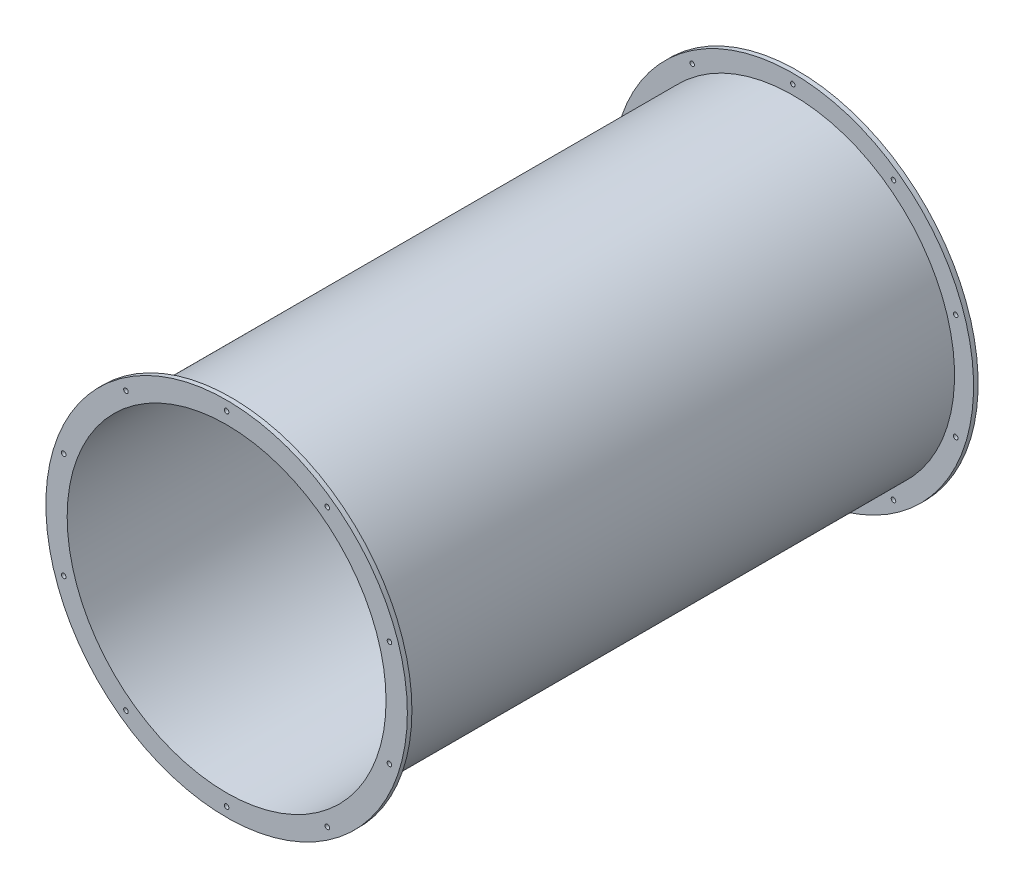
ISO-10303-21;
HEADER;
FILE_DESCRIPTION(('STEP AP214'),'2;1');
FILE_NAME('part.step','',(''),(''),'','','');
FILE_SCHEMA(('AUTOMOTIVE_DESIGN { 1 0 10303 214 1 1 1 1 }'));
ENDSEC;
DATA;
#1=APPLICATION_CONTEXT('core data for automotive mechanical design processes');
#2=APPLICATION_PROTOCOL_DEFINITION('international standard','automotive_design',2000,#1);
#3=PRODUCT_CONTEXT('',#1,'mechanical');
#4=PRODUCT('Part','Part','',(#3));
#5=PRODUCT_RELATED_PRODUCT_CATEGORY('part','',(#4));
#6=PRODUCT_DEFINITION_FORMATION('','',#4);
#7=PRODUCT_DEFINITION_CONTEXT('part definition',#1,'design');
#8=PRODUCT_DEFINITION('design','',#6,#7);
#9=PRODUCT_DEFINITION_SHAPE('','',#8);
#10=(LENGTH_UNIT() NAMED_UNIT(*) SI_UNIT(.MILLI.,.METRE.));
#11=(NAMED_UNIT(*) PLANE_ANGLE_UNIT() SI_UNIT($,.RADIAN.));
#12=(NAMED_UNIT(*) SI_UNIT($,.STERADIAN.) SOLID_ANGLE_UNIT());
#13=UNCERTAINTY_MEASURE_WITH_UNIT(LENGTH_MEASURE(1.E-05),#10,'distance_accuracy_value','');
#14=(GEOMETRIC_REPRESENTATION_CONTEXT(3) GLOBAL_UNCERTAINTY_ASSIGNED_CONTEXT((#13)) GLOBAL_UNIT_ASSIGNED_CONTEXT((#10,
#11,#12)) REPRESENTATION_CONTEXT('',''));
#15=CARTESIAN_POINT('',(0.,0.,0.));
#16=DIRECTION('',(0.,0.,1.));
#17=DIRECTION('',(1.,0.,0.));
#18=AXIS2_PLACEMENT_3D('',#15,#16,#17);
#19=CARTESIAN_POINT('',(0.,0.,1500.));
#20=DIRECTION('',(0.,0.,-1.));
#21=DIRECTION('',(-1.,0.,0.));
#22=AXIS2_PLACEMENT_3D('',#19,#20,#21);
#23=CYLINDRICAL_SURFACE('',#22,425.);
#24=CARTESIAN_POINT('',(0.,0.,1488.));
#25=DIRECTION('',(0.,0.,1.));
#26=DIRECTION('',(1.,0.,0.));
#27=AXIS2_PLACEMENT_3D('',#24,#25,#26);
#28=CIRCLE('',#27,425.);
#29=CARTESIAN_POINT('',(425.,0.,1488.));
#30=VERTEX_POINT('',#29);
#31=EDGE_CURVE('E39',#30,#30,#28,.T.);
#32=ORIENTED_EDGE('',*,*,#31,.F.);
#33=EDGE_LOOP('',(#32));
#34=FACE_BOUND('',#33,.T.);
#35=CARTESIAN_POINT('',(0.,0.,12.));
#36=DIRECTION('',(0.,0.,-1.));
#37=DIRECTION('',(-1.,0.,0.));
#38=AXIS2_PLACEMENT_3D('',#35,#36,#37);
#39=CIRCLE('',#38,425.);
#40=CARTESIAN_POINT('',(-425.,0.,12.));
#41=VERTEX_POINT('',#40);
#42=EDGE_CURVE('E10',#41,#41,#39,.T.);
#43=ORIENTED_EDGE('',*,*,#42,.F.);
#44=EDGE_LOOP('',(#43));
#45=FACE_BOUND('',#44,.T.);
#46=ADVANCED_FACE('F32',(#34,#45),#23,.T.);
#47=CARTESIAN_POINT('',(0.,0.,1500.));
#48=DIRECTION('',(0.,0.,1.));
#49=DIRECTION('',(1.,0.,0.));
#50=AXIS2_PLACEMENT_3D('',#47,#48,#49);
#51=PLANE('',#50);
#52=CARTESIAN_POINT('',(0.,450.,1500.));
#53=DIRECTION('',(0.,0.,1.));
#54=DIRECTION('',(1.,0.,0.));
#55=AXIS2_PLACEMENT_3D('',#52,#53,#54);
#56=CIRCLE('',#55,6.00000000000001);
#57=CARTESIAN_POINT('',(6.00000000000001,450.,1500.));
#58=VERTEX_POINT('',#57);
#59=EDGE_CURVE('E256',#58,#58,#56,.T.);
#60=ORIENTED_EDGE('',*,*,#59,.F.);
#61=EDGE_LOOP('',(#60));
#62=FACE_BOUND('',#61,.T.);
#63=CARTESIAN_POINT('',(-264.503363531613,364.057647468727,1500.));
#64=DIRECTION('',(0.,0.,1.));
#65=DIRECTION('',(1.,0.,0.));
#66=AXIS2_PLACEMENT_3D('',#63,#64,#65);
#67=CIRCLE('',#66,5.99999999999999);
#68=CARTESIAN_POINT('',(-258.503363531613,364.057647468727,1500.));
#69=VERTEX_POINT('',#68);
#70=EDGE_CURVE('E264',#69,#69,#67,.T.);
#71=ORIENTED_EDGE('',*,*,#70,.F.);
#72=EDGE_LOOP('',(#71));
#73=FACE_BOUND('',#72,.T.);
#74=CARTESIAN_POINT('',(-427.975432332819,139.057647468727,1500.));
#75=DIRECTION('',(0.,0.,1.));
#76=DIRECTION('',(1.,0.,0.));
#77=AXIS2_PLACEMENT_3D('',#74,#75,#76);
#78=CIRCLE('',#77,5.99999999999999);
#79=CARTESIAN_POINT('',(-421.975432332819,139.057647468727,1500.));
#80=VERTEX_POINT('',#79);
#81=EDGE_CURVE('E305',#80,#80,#78,.T.);
#82=ORIENTED_EDGE('',*,*,#81,.F.);
#83=EDGE_LOOP('',(#82));
#84=FACE_BOUND('',#83,.T.);
#85=CARTESIAN_POINT('',(-427.975432332819,-139.057647468725,1500.));
#86=DIRECTION('',(0.,0.,1.));
#87=DIRECTION('',(1.,0.,0.));
#88=AXIS2_PLACEMENT_3D('',#85,#86,#87);
#89=CIRCLE('',#88,5.99999999999999);
#90=CARTESIAN_POINT('',(-421.975432332819,-139.057647468725,1500.));
#91=VERTEX_POINT('',#90);
#92=EDGE_CURVE('E299',#91,#91,#89,.T.);
#93=ORIENTED_EDGE('',*,*,#92,.F.);
#94=EDGE_LOOP('',(#93));
#95=FACE_BOUND('',#94,.T.);
#96=CARTESIAN_POINT('',(-264.503363531613,-364.057647468725,1500.));
#97=DIRECTION('',(0.,0.,1.));
#98=DIRECTION('',(1.,0.,0.));
#99=AXIS2_PLACEMENT_3D('',#96,#97,#98);
#100=CIRCLE('',#99,5.99999999999999);
#101=CARTESIAN_POINT('',(-258.503363531613,-364.057647468725,1500.));
#102=VERTEX_POINT('',#101);
#103=EDGE_CURVE('E293',#102,#102,#100,.T.);
#104=ORIENTED_EDGE('',*,*,#103,.F.);
#105=EDGE_LOOP('',(#104));
#106=FACE_BOUND('',#105,.T.);
#107=CARTESIAN_POINT('',(-2.5369087789741E-13,-449.999999999999,1500.));
#108=DIRECTION('',(0.,0.,1.));
#109=DIRECTION('',(1.,0.,0.));
#110=AXIS2_PLACEMENT_3D('',#107,#108,#109);
#111=CIRCLE('',#110,6.00000000000001);
#112=CARTESIAN_POINT('',(5.99999999999976,-449.999999999999,1500.));
#113=VERTEX_POINT('',#112);
#114=EDGE_CURVE('E287',#113,#113,#111,.T.);
#115=ORIENTED_EDGE('',*,*,#114,.F.);
#116=EDGE_LOOP('',(#115));
#117=FACE_BOUND('',#116,.T.);
#118=CARTESIAN_POINT('',(264.503363531612,-364.057647468725,1500.));
#119=DIRECTION('',(0.,0.,1.));
#120=DIRECTION('',(1.,0.,0.));
#121=AXIS2_PLACEMENT_3D('',#118,#119,#120);
#122=CIRCLE('',#121,5.99999999999999);
#123=CARTESIAN_POINT('',(270.503363531612,-364.057647468725,1500.));
#124=VERTEX_POINT('',#123);
#125=EDGE_CURVE('E281',#124,#124,#122,.T.);
#126=ORIENTED_EDGE('',*,*,#125,.F.);
#127=EDGE_LOOP('',(#126));
#128=FACE_BOUND('',#127,.T.);
#129=CARTESIAN_POINT('',(427.975432332818,-139.057647468726,1500.));
#130=DIRECTION('',(0.,0.,1.));
#131=DIRECTION('',(1.,0.,0.));
#132=AXIS2_PLACEMENT_3D('',#129,#130,#131);
#133=CIRCLE('',#132,5.99999999999999);
#134=CARTESIAN_POINT('',(433.975432332818,-139.057647468726,1500.));
#135=VERTEX_POINT('',#134);
#136=EDGE_CURVE('E275',#135,#135,#133,.T.);
#137=ORIENTED_EDGE('',*,*,#136,.F.);
#138=EDGE_LOOP('',(#137));
#139=FACE_BOUND('',#138,.T.);
#140=CARTESIAN_POINT('',(427.975432332818,139.057647468727,1500.));
#141=DIRECTION('',(0.,0.,1.));
#142=DIRECTION('',(1.,0.,0.));
#143=AXIS2_PLACEMENT_3D('',#140,#141,#142);
#144=CIRCLE('',#143,5.99999999999999);
#145=CARTESIAN_POINT('',(433.975432332819,139.057647468727,1500.));
#146=VERTEX_POINT('',#145);
#147=EDGE_CURVE('E269',#146,#146,#144,.T.);
#148=ORIENTED_EDGE('',*,*,#147,.F.);
#149=EDGE_LOOP('',(#148));
#150=FACE_BOUND('',#149,.T.);
#151=CARTESIAN_POINT('',(264.503363531612,364.057647468727,1500.));
#152=DIRECTION('',(0.,0.,1.));
#153=DIRECTION('',(1.,0.,0.));
#154=AXIS2_PLACEMENT_3D('',#151,#152,#153);
#155=CIRCLE('',#154,5.99999999999999);
#156=CARTESIAN_POINT('',(270.503363531612,364.057647468727,1500.));
#157=VERTEX_POINT('',#156);
#158=EDGE_CURVE('E257',#157,#157,#155,.T.);
#159=ORIENTED_EDGE('',*,*,#158,.F.);
#160=EDGE_LOOP('',(#159));
#161=FACE_BOUND('',#160,.T.);
#162=CARTESIAN_POINT('',(0.,0.,1500.));
#163=DIRECTION('',(0.,0.,1.));
#164=DIRECTION('',(1.,0.,0.));
#165=AXIS2_PLACEMENT_3D('',#162,#163,#164);
#166=CIRCLE('',#165,419.);
#167=CARTESIAN_POINT('',(419.,0.,1500.));
#168=VERTEX_POINT('',#167);
#169=EDGE_CURVE('E44',#168,#168,#166,.T.);
#170=ORIENTED_EDGE('',*,*,#169,.F.);
#171=EDGE_LOOP('',(#170));
#172=FACE_BOUND('',#171,.T.);
#173=CARTESIAN_POINT('',(0.,0.,1500.));
#174=DIRECTION('',(0.,0.,1.));
#175=DIRECTION('',(1.,0.,0.));
#176=AXIS2_PLACEMENT_3D('',#173,#174,#175);
#177=CIRCLE('',#176,475.);
#178=CARTESIAN_POINT('',(475.,0.,1500.));
#179=VERTEX_POINT('',#178);
#180=EDGE_CURVE('E101',#179,#179,#177,.T.);
#181=ORIENTED_EDGE('',*,*,#180,.T.);
#182=EDGE_LOOP('',(#181));
#183=FACE_BOUND('',#182,.T.);
#184=ADVANCED_FACE('F129',(#62,#73,#84,#95,#106,#117,#128,#139,#150,#161,#172,#183),#51,.T.);
#185=CARTESIAN_POINT('',(0.,0.,0.));
#186=DIRECTION('',(0.,0.,1.));
#187=DIRECTION('',(1.,0.,0.));
#188=AXIS2_PLACEMENT_3D('',#185,#186,#187);
#189=PLANE('',#188);
#190=CARTESIAN_POINT('',(0.,450.,0.));
#191=DIRECTION('',(0.,0.,1.));
#192=DIRECTION('',(1.,0.,0.));
#193=AXIS2_PLACEMENT_3D('',#190,#191,#192);
#194=CIRCLE('',#193,6.00000000000001);
#195=CARTESIAN_POINT('',(6.00000000000001,450.,0.));
#196=VERTEX_POINT('',#195);
#197=EDGE_CURVE('E52',#196,#196,#194,.T.);
#198=ORIENTED_EDGE('',*,*,#197,.T.);
#199=EDGE_LOOP('',(#198));
#200=FACE_BOUND('',#199,.T.);
#201=CARTESIAN_POINT('',(-264.503363531613,364.057647468727,0.));
#202=DIRECTION('',(0.,0.,1.));
#203=DIRECTION('',(1.,0.,0.));
#204=AXIS2_PLACEMENT_3D('',#201,#202,#203);
#205=CIRCLE('',#204,5.99999999999999);
#206=CARTESIAN_POINT('',(-258.503363531613,364.057647468727,0.));
#207=VERTEX_POINT('',#206);
#208=EDGE_CURVE('E308',#207,#207,#205,.T.);
#209=ORIENTED_EDGE('',*,*,#208,.T.);
#210=EDGE_LOOP('',(#209));
#211=FACE_BOUND('',#210,.T.);
#212=CARTESIAN_POINT('',(-427.975432332819,139.057647468727,0.));
#213=DIRECTION('',(0.,0.,1.));
#214=DIRECTION('',(1.,0.,0.));
#215=AXIS2_PLACEMENT_3D('',#212,#213,#214);
#216=CIRCLE('',#215,5.99999999999999);
#217=CARTESIAN_POINT('',(-421.975432332819,139.057647468727,0.));
#218=VERTEX_POINT('',#217);
#219=EDGE_CURVE('E302',#218,#218,#216,.T.);
#220=ORIENTED_EDGE('',*,*,#219,.T.);
#221=EDGE_LOOP('',(#220));
#222=FACE_BOUND('',#221,.T.);
#223=CARTESIAN_POINT('',(-427.975432332819,-139.057647468725,0.));
#224=DIRECTION('',(0.,0.,1.));
#225=DIRECTION('',(1.,0.,0.));
#226=AXIS2_PLACEMENT_3D('',#223,#224,#225);
#227=CIRCLE('',#226,5.99999999999999);
#228=CARTESIAN_POINT('',(-421.975432332819,-139.057647468725,0.));
#229=VERTEX_POINT('',#228);
#230=EDGE_CURVE('E296',#229,#229,#227,.T.);
#231=ORIENTED_EDGE('',*,*,#230,.T.);
#232=EDGE_LOOP('',(#231));
#233=FACE_BOUND('',#232,.T.);
#234=CARTESIAN_POINT('',(-264.503363531613,-364.057647468725,0.));
#235=DIRECTION('',(0.,0.,1.));
#236=DIRECTION('',(1.,0.,0.));
#237=AXIS2_PLACEMENT_3D('',#234,#235,#236);
#238=CIRCLE('',#237,5.99999999999999);
#239=CARTESIAN_POINT('',(-258.503363531613,-364.057647468725,0.));
#240=VERTEX_POINT('',#239);
#241=EDGE_CURVE('E290',#240,#240,#238,.T.);
#242=ORIENTED_EDGE('',*,*,#241,.T.);
#243=EDGE_LOOP('',(#242));
#244=FACE_BOUND('',#243,.T.);
#245=CARTESIAN_POINT('',(-2.5369087789741E-13,-449.999999999999,0.));
#246=DIRECTION('',(0.,0.,1.));
#247=DIRECTION('',(1.,0.,0.));
#248=AXIS2_PLACEMENT_3D('',#245,#246,#247);
#249=CIRCLE('',#248,6.00000000000001);
#250=CARTESIAN_POINT('',(5.99999999999976,-449.999999999999,0.));
#251=VERTEX_POINT('',#250);
#252=EDGE_CURVE('E284',#251,#251,#249,.T.);
#253=ORIENTED_EDGE('',*,*,#252,.T.);
#254=EDGE_LOOP('',(#253));
#255=FACE_BOUND('',#254,.T.);
#256=CARTESIAN_POINT('',(264.503363531612,-364.057647468725,0.));
#257=DIRECTION('',(0.,0.,1.));
#258=DIRECTION('',(1.,0.,0.));
#259=AXIS2_PLACEMENT_3D('',#256,#257,#258);
#260=CIRCLE('',#259,5.99999999999999);
#261=CARTESIAN_POINT('',(270.503363531612,-364.057647468725,0.));
#262=VERTEX_POINT('',#261);
#263=EDGE_CURVE('E278',#262,#262,#260,.T.);
#264=ORIENTED_EDGE('',*,*,#263,.T.);
#265=EDGE_LOOP('',(#264));
#266=FACE_BOUND('',#265,.T.);
#267=CARTESIAN_POINT('',(427.975432332818,-139.057647468726,0.));
#268=DIRECTION('',(0.,0.,1.));
#269=DIRECTION('',(1.,0.,0.));
#270=AXIS2_PLACEMENT_3D('',#267,#268,#269);
#271=CIRCLE('',#270,5.99999999999999);
#272=CARTESIAN_POINT('',(433.975432332818,-139.057647468726,0.));
#273=VERTEX_POINT('',#272);
#274=EDGE_CURVE('E272',#273,#273,#271,.T.);
#275=ORIENTED_EDGE('',*,*,#274,.T.);
#276=EDGE_LOOP('',(#275));
#277=FACE_BOUND('',#276,.T.);
#278=CARTESIAN_POINT('',(427.975432332818,139.057647468727,0.));
#279=DIRECTION('',(0.,0.,1.));
#280=DIRECTION('',(1.,0.,0.));
#281=AXIS2_PLACEMENT_3D('',#278,#279,#280);
#282=CIRCLE('',#281,5.99999999999999);
#283=CARTESIAN_POINT('',(433.975432332819,139.057647468727,0.));
#284=VERTEX_POINT('',#283);
#285=EDGE_CURVE('E261',#284,#284,#282,.T.);
#286=ORIENTED_EDGE('',*,*,#285,.T.);
#287=EDGE_LOOP('',(#286));
#288=FACE_BOUND('',#287,.T.);
#289=CARTESIAN_POINT('',(264.503363531612,364.057647468727,0.));
#290=DIRECTION('',(0.,0.,1.));
#291=DIRECTION('',(1.,0.,0.));
#292=AXIS2_PLACEMENT_3D('',#289,#290,#291);
#293=CIRCLE('',#292,5.99999999999999);
#294=CARTESIAN_POINT('',(270.503363531612,364.057647468727,0.));
#295=VERTEX_POINT('',#294);
#296=EDGE_CURVE('E254',#295,#295,#293,.T.);
#297=ORIENTED_EDGE('',*,*,#296,.T.);
#298=EDGE_LOOP('',(#297));
#299=FACE_BOUND('',#298,.T.);
#300=CARTESIAN_POINT('',(0.,0.,0.));
#301=DIRECTION('',(0.,0.,1.));
#302=DIRECTION('',(1.,0.,0.));
#303=AXIS2_PLACEMENT_3D('',#300,#301,#302);
#304=CIRCLE('',#303,419.);
#305=CARTESIAN_POINT('',(419.,0.,0.));
#306=VERTEX_POINT('',#305);
#307=EDGE_CURVE('E107',#306,#306,#304,.T.);
#308=ORIENTED_EDGE('',*,*,#307,.T.);
#309=EDGE_LOOP('',(#308));
#310=FACE_BOUND('',#309,.T.);
#311=CARTESIAN_POINT('',(0.,0.,0.));
#312=DIRECTION('',(0.,0.,-1.));
#313=DIRECTION('',(-1.,0.,0.));
#314=AXIS2_PLACEMENT_3D('',#311,#312,#313);
#315=CIRCLE('',#314,475.);
#316=CARTESIAN_POINT('',(-475.,0.,0.));
#317=VERTEX_POINT('',#316);
#318=EDGE_CURVE('E97',#317,#317,#315,.T.);
#319=ORIENTED_EDGE('',*,*,#318,.T.);
#320=EDGE_LOOP('',(#319));
#321=FACE_BOUND('',#320,.T.);
#322=ADVANCED_FACE('F114',(#200,#211,#222,#233,#244,#255,#266,#277,#288,#299,#310,#321),#189,.F.);
#323=CARTESIAN_POINT('',(0.,0.,1500.));
#324=DIRECTION('',(0.,0.,-1.));
#325=DIRECTION('',(-1.,0.,0.));
#326=AXIS2_PLACEMENT_3D('',#323,#324,#325);
#327=CYLINDRICAL_SURFACE('',#326,419.);
#328=ORIENTED_EDGE('',*,*,#169,.T.);
#329=EDGE_LOOP('',(#328));
#330=FACE_BOUND('',#329,.T.);
#331=ORIENTED_EDGE('',*,*,#307,.F.);
#332=EDGE_LOOP('',(#331));
#333=FACE_BOUND('',#332,.T.);
#334=ADVANCED_FACE('F117',(#330,#333),#327,.F.);
#335=CARTESIAN_POINT('',(0.,0.,1488.));
#336=DIRECTION('',(0.,0.,1.));
#337=DIRECTION('',(1.,0.,0.));
#338=AXIS2_PLACEMENT_3D('',#335,#336,#337);
#339=CYLINDRICAL_SURFACE('',#338,475.);
#340=CARTESIAN_POINT('',(0.,0.,1488.));
#341=DIRECTION('',(0.,0.,1.));
#342=DIRECTION('',(1.,0.,0.));
#343=AXIS2_PLACEMENT_3D('',#340,#341,#342);
#344=CIRCLE('',#343,475.);
#345=CARTESIAN_POINT('',(475.,0.,1488.));
#346=VERTEX_POINT('',#345);
#347=EDGE_CURVE('E104',#346,#346,#344,.T.);
#348=ORIENTED_EDGE('',*,*,#347,.T.);
#349=EDGE_LOOP('',(#348));
#350=FACE_BOUND('',#349,.T.);
#351=ORIENTED_EDGE('',*,*,#180,.F.);
#352=EDGE_LOOP('',(#351));
#353=FACE_BOUND('',#352,.T.);
#354=ADVANCED_FACE('F119',(#350,#353),#339,.T.);
#355=CARTESIAN_POINT('',(0.,0.,1488.));
#356=DIRECTION('',(0.,0.,1.));
#357=DIRECTION('',(1.,0.,0.));
#358=AXIS2_PLACEMENT_3D('',#355,#356,#357);
#359=PLANE('',#358);
#360=CARTESIAN_POINT('',(0.,450.,1488.));
#361=DIRECTION('',(0.,0.,1.));
#362=DIRECTION('',(1.,0.,0.));
#363=AXIS2_PLACEMENT_3D('',#360,#361,#362);
#364=CIRCLE('',#363,6.00000000000001);
#365=CARTESIAN_POINT('',(6.00000000000001,450.,1488.));
#366=VERTEX_POINT('',#365);
#367=EDGE_CURVE('E94',#366,#366,#364,.T.);
#368=ORIENTED_EDGE('',*,*,#367,.T.);
#369=EDGE_LOOP('',(#368));
#370=FACE_BOUND('',#369,.T.);
#371=CARTESIAN_POINT('',(-264.503363531613,364.057647468727,1488.));
#372=DIRECTION('',(0.,0.,1.));
#373=DIRECTION('',(1.,0.,0.));
#374=AXIS2_PLACEMENT_3D('',#371,#372,#373);
#375=CIRCLE('',#374,5.99999999999999);
#376=CARTESIAN_POINT('',(-258.503363531613,364.057647468727,1488.));
#377=VERTEX_POINT('',#376);
#378=EDGE_CURVE('E82',#377,#377,#375,.T.);
#379=ORIENTED_EDGE('',*,*,#378,.T.);
#380=EDGE_LOOP('',(#379));
#381=FACE_BOUND('',#380,.T.);
#382=CARTESIAN_POINT('',(-427.975432332819,139.057647468727,1488.));
#383=DIRECTION('',(0.,0.,1.));
#384=DIRECTION('',(1.,0.,0.));
#385=AXIS2_PLACEMENT_3D('',#382,#383,#384);
#386=CIRCLE('',#385,5.99999999999999);
#387=CARTESIAN_POINT('',(-421.975432332819,139.057647468727,1488.));
#388=VERTEX_POINT('',#387);
#389=EDGE_CURVE('E79',#388,#388,#386,.T.);
#390=ORIENTED_EDGE('',*,*,#389,.T.);
#391=EDGE_LOOP('',(#390));
#392=FACE_BOUND('',#391,.T.);
#393=CARTESIAN_POINT('',(-427.975432332819,-139.057647468725,1488.));
#394=DIRECTION('',(0.,0.,1.));
#395=DIRECTION('',(1.,0.,0.));
#396=AXIS2_PLACEMENT_3D('',#393,#394,#395);
#397=CIRCLE('',#396,5.99999999999999);
#398=CARTESIAN_POINT('',(-421.975432332819,-139.057647468725,1488.));
#399=VERTEX_POINT('',#398);
#400=EDGE_CURVE('E76',#399,#399,#397,.T.);
#401=ORIENTED_EDGE('',*,*,#400,.T.);
#402=EDGE_LOOP('',(#401));
#403=FACE_BOUND('',#402,.T.);
#404=CARTESIAN_POINT('',(-264.503363531613,-364.057647468725,1488.));
#405=DIRECTION('',(0.,0.,1.));
#406=DIRECTION('',(1.,0.,0.));
#407=AXIS2_PLACEMENT_3D('',#404,#405,#406);
#408=CIRCLE('',#407,5.99999999999999);
#409=CARTESIAN_POINT('',(-258.503363531613,-364.057647468725,1488.));
#410=VERTEX_POINT('',#409);
#411=EDGE_CURVE('E72',#410,#410,#408,.T.);
#412=ORIENTED_EDGE('',*,*,#411,.T.);
#413=EDGE_LOOP('',(#412));
#414=FACE_BOUND('',#413,.T.);
#415=CARTESIAN_POINT('',(-2.5369087789741E-13,-449.999999999999,1488.));
#416=DIRECTION('',(0.,0.,1.));
#417=DIRECTION('',(1.,0.,0.));
#418=AXIS2_PLACEMENT_3D('',#415,#416,#417);
#419=CIRCLE('',#418,6.00000000000001);
#420=CARTESIAN_POINT('',(5.99999999999976,-449.999999999999,1488.));
#421=VERTEX_POINT('',#420);
#422=EDGE_CURVE('E68',#421,#421,#419,.T.);
#423=ORIENTED_EDGE('',*,*,#422,.T.);
#424=EDGE_LOOP('',(#423));
#425=FACE_BOUND('',#424,.T.);
#426=CARTESIAN_POINT('',(264.503363531612,-364.057647468725,1488.));
#427=DIRECTION('',(0.,0.,1.));
#428=DIRECTION('',(1.,0.,0.));
#429=AXIS2_PLACEMENT_3D('',#426,#427,#428);
#430=CIRCLE('',#429,5.99999999999999);
#431=CARTESIAN_POINT('',(270.503363531612,-364.057647468725,1488.));
#432=VERTEX_POINT('',#431);
#433=EDGE_CURVE('E64',#432,#432,#430,.T.);
#434=ORIENTED_EDGE('',*,*,#433,.T.);
#435=EDGE_LOOP('',(#434));
#436=FACE_BOUND('',#435,.T.);
#437=CARTESIAN_POINT('',(427.975432332818,-139.057647468726,1488.));
#438=DIRECTION('',(0.,0.,1.));
#439=DIRECTION('',(1.,0.,0.));
#440=AXIS2_PLACEMENT_3D('',#437,#438,#439);
#441=CIRCLE('',#440,5.99999999999999);
#442=CARTESIAN_POINT('',(433.975432332818,-139.057647468726,1488.));
#443=VERTEX_POINT('',#442);
#444=EDGE_CURVE('E60',#443,#443,#441,.T.);
#445=ORIENTED_EDGE('',*,*,#444,.T.);
#446=EDGE_LOOP('',(#445));
#447=FACE_BOUND('',#446,.T.);
#448=CARTESIAN_POINT('',(427.975432332818,139.057647468727,1488.));
#449=DIRECTION('',(0.,0.,1.));
#450=DIRECTION('',(1.,0.,0.));
#451=AXIS2_PLACEMENT_3D('',#448,#449,#450);
#452=CIRCLE('',#451,5.99999999999999);
#453=CARTESIAN_POINT('',(433.975432332819,139.057647468727,1488.));
#454=VERTEX_POINT('',#453);
#455=EDGE_CURVE('E56',#454,#454,#452,.T.);
#456=ORIENTED_EDGE('',*,*,#455,.T.);
#457=EDGE_LOOP('',(#456));
#458=FACE_BOUND('',#457,.T.);
#459=CARTESIAN_POINT('',(264.503363531612,364.057647468727,1488.));
#460=DIRECTION('',(0.,0.,1.));
#461=DIRECTION('',(1.,0.,0.));
#462=AXIS2_PLACEMENT_3D('',#459,#460,#461);
#463=CIRCLE('',#462,5.99999999999999);
#464=CARTESIAN_POINT('',(270.503363531612,364.057647468727,1488.));
#465=VERTEX_POINT('',#464);
#466=EDGE_CURVE('E51',#465,#465,#463,.T.);
#467=ORIENTED_EDGE('',*,*,#466,.T.);
#468=EDGE_LOOP('',(#467));
#469=FACE_BOUND('',#468,.T.);
#470=ORIENTED_EDGE('',*,*,#31,.T.);
#471=EDGE_LOOP('',(#470));
#472=FACE_BOUND('',#471,.T.);
#473=ORIENTED_EDGE('',*,*,#347,.F.);
#474=EDGE_LOOP('',(#473));
#475=FACE_BOUND('',#474,.T.);
#476=ADVANCED_FACE('F126',(#370,#381,#392,#403,#414,#425,#436,#447,#458,#469,#472,#475),#359,.F.);
#477=CARTESIAN_POINT('',(0.,0.,12.));
#478=DIRECTION('',(0.,0.,-1.));
#479=DIRECTION('',(-1.,0.,0.));
#480=AXIS2_PLACEMENT_3D('',#477,#478,#479);
#481=CYLINDRICAL_SURFACE('',#480,475.);
#482=CARTESIAN_POINT('',(0.,0.,12.));
#483=DIRECTION('',(0.,0.,-1.));
#484=DIRECTION('',(-1.,0.,0.));
#485=AXIS2_PLACEMENT_3D('',#482,#483,#484);
#486=CIRCLE('',#485,475.);
#487=CARTESIAN_POINT('',(-475.,0.,12.));
#488=VERTEX_POINT('',#487);
#489=EDGE_CURVE('E98',#488,#488,#486,.T.);
#490=ORIENTED_EDGE('',*,*,#489,.T.);
#491=EDGE_LOOP('',(#490));
#492=FACE_BOUND('',#491,.T.);
#493=ORIENTED_EDGE('',*,*,#318,.F.);
#494=EDGE_LOOP('',(#493));
#495=FACE_BOUND('',#494,.T.);
#496=ADVANCED_FACE('F143',(#492,#495),#481,.T.);
#497=CARTESIAN_POINT('',(0.,0.,12.));
#498=DIRECTION('',(0.,0.,-1.));
#499=DIRECTION('',(-1.,0.,0.));
#500=AXIS2_PLACEMENT_3D('',#497,#498,#499);
#501=PLANE('',#500);
#502=CARTESIAN_POINT('',(0.,450.,12.));
#503=DIRECTION('',(0.,0.,-1.));
#504=DIRECTION('',(-1.,0.,0.));
#505=AXIS2_PLACEMENT_3D('',#502,#503,#504);
#506=CIRCLE('',#505,6.00000000000001);
#507=CARTESIAN_POINT('',(-6.00000000000001,450.,12.));
#508=VERTEX_POINT('',#507);
#509=EDGE_CURVE('E35',#508,#508,#506,.T.);
#510=ORIENTED_EDGE('',*,*,#509,.T.);
#511=EDGE_LOOP('',(#510));
#512=FACE_BOUND('',#511,.T.);
#513=CARTESIAN_POINT('',(-264.503363531613,364.057647468727,12.));
#514=DIRECTION('',(0.,0.,-1.));
#515=DIRECTION('',(-1.,0.,0.));
#516=AXIS2_PLACEMENT_3D('',#513,#514,#515);
#517=CIRCLE('',#516,5.99999999999999);
#518=CARTESIAN_POINT('',(-270.503363531613,364.057647468727,12.));
#519=VERTEX_POINT('',#518);
#520=EDGE_CURVE('E80',#519,#519,#517,.T.);
#521=ORIENTED_EDGE('',*,*,#520,.T.);
#522=EDGE_LOOP('',(#521));
#523=FACE_BOUND('',#522,.T.);
#524=CARTESIAN_POINT('',(-427.975432332819,139.057647468727,12.));
#525=DIRECTION('',(0.,0.,-1.));
#526=DIRECTION('',(-1.,0.,0.));
#527=AXIS2_PLACEMENT_3D('',#524,#525,#526);
#528=CIRCLE('',#527,5.99999999999999);
#529=CARTESIAN_POINT('',(-433.975432332819,139.057647468727,12.));
#530=VERTEX_POINT('',#529);
#531=EDGE_CURVE('E77',#530,#530,#528,.T.);
#532=ORIENTED_EDGE('',*,*,#531,.T.);
#533=EDGE_LOOP('',(#532));
#534=FACE_BOUND('',#533,.T.);
#535=CARTESIAN_POINT('',(-427.975432332819,-139.057647468725,12.));
#536=DIRECTION('',(0.,0.,-1.));
#537=DIRECTION('',(-1.,0.,0.));
#538=AXIS2_PLACEMENT_3D('',#535,#536,#537);
#539=CIRCLE('',#538,5.99999999999999);
#540=CARTESIAN_POINT('',(-433.975432332819,-139.057647468725,12.));
#541=VERTEX_POINT('',#540);
#542=EDGE_CURVE('E73',#541,#541,#539,.T.);
#543=ORIENTED_EDGE('',*,*,#542,.T.);
#544=EDGE_LOOP('',(#543));
#545=FACE_BOUND('',#544,.T.);
#546=CARTESIAN_POINT('',(-264.503363531613,-364.057647468725,12.));
#547=DIRECTION('',(0.,0.,-1.));
#548=DIRECTION('',(-1.,0.,0.));
#549=AXIS2_PLACEMENT_3D('',#546,#547,#548);
#550=CIRCLE('',#549,5.99999999999999);
#551=CARTESIAN_POINT('',(-270.503363531613,-364.057647468725,12.));
#552=VERTEX_POINT('',#551);
#553=EDGE_CURVE('E69',#552,#552,#550,.T.);
#554=ORIENTED_EDGE('',*,*,#553,.T.);
#555=EDGE_LOOP('',(#554));
#556=FACE_BOUND('',#555,.T.);
#557=CARTESIAN_POINT('',(-2.5369087789741E-13,-449.999999999999,12.));
#558=DIRECTION('',(0.,0.,-1.));
#559=DIRECTION('',(-1.,0.,0.));
#560=AXIS2_PLACEMENT_3D('',#557,#558,#559);
#561=CIRCLE('',#560,6.00000000000001);
#562=CARTESIAN_POINT('',(-6.00000000000026,-449.999999999999,12.));
#563=VERTEX_POINT('',#562);
#564=EDGE_CURVE('E65',#563,#563,#561,.T.);
#565=ORIENTED_EDGE('',*,*,#564,.T.);
#566=EDGE_LOOP('',(#565));
#567=FACE_BOUND('',#566,.T.);
#568=CARTESIAN_POINT('',(264.503363531612,-364.057647468725,12.));
#569=DIRECTION('',(0.,0.,-1.));
#570=DIRECTION('',(-1.,0.,0.));
#571=AXIS2_PLACEMENT_3D('',#568,#569,#570);
#572=CIRCLE('',#571,5.99999999999999);
#573=CARTESIAN_POINT('',(258.503363531612,-364.057647468725,12.));
#574=VERTEX_POINT('',#573);
#575=EDGE_CURVE('E61',#574,#574,#572,.T.);
#576=ORIENTED_EDGE('',*,*,#575,.T.);
#577=EDGE_LOOP('',(#576));
#578=FACE_BOUND('',#577,.T.);
#579=CARTESIAN_POINT('',(427.975432332818,-139.057647468726,12.));
#580=DIRECTION('',(0.,0.,-1.));
#581=DIRECTION('',(-1.,0.,0.));
#582=AXIS2_PLACEMENT_3D('',#579,#580,#581);
#583=CIRCLE('',#582,5.99999999999999);
#584=CARTESIAN_POINT('',(421.975432332818,-139.057647468726,12.));
#585=VERTEX_POINT('',#584);
#586=EDGE_CURVE('E57',#585,#585,#583,.T.);
#587=ORIENTED_EDGE('',*,*,#586,.T.);
#588=EDGE_LOOP('',(#587));
#589=FACE_BOUND('',#588,.T.);
#590=CARTESIAN_POINT('',(427.975432332818,139.057647468727,12.));
#591=DIRECTION('',(0.,0.,-1.));
#592=DIRECTION('',(-1.,0.,0.));
#593=AXIS2_PLACEMENT_3D('',#590,#591,#592);
#594=CIRCLE('',#593,5.99999999999999);
#595=CARTESIAN_POINT('',(421.975432332818,139.057647468727,12.));
#596=VERTEX_POINT('',#595);
#597=EDGE_CURVE('E53',#596,#596,#594,.T.);
#598=ORIENTED_EDGE('',*,*,#597,.T.);
#599=EDGE_LOOP('',(#598));
#600=FACE_BOUND('',#599,.T.);
#601=CARTESIAN_POINT('',(264.503363531612,364.057647468727,12.));
#602=DIRECTION('',(0.,0.,-1.));
#603=DIRECTION('',(-1.,0.,0.));
#604=AXIS2_PLACEMENT_3D('',#601,#602,#603);
#605=CIRCLE('',#604,5.99999999999999);
#606=CARTESIAN_POINT('',(258.503363531612,364.057647468727,12.));
#607=VERTEX_POINT('',#606);
#608=EDGE_CURVE('E48',#607,#607,#605,.T.);
#609=ORIENTED_EDGE('',*,*,#608,.T.);
#610=EDGE_LOOP('',(#609));
#611=FACE_BOUND('',#610,.T.);
#612=ORIENTED_EDGE('',*,*,#42,.T.);
#613=EDGE_LOOP('',(#612));
#614=FACE_BOUND('',#613,.T.);
#615=ORIENTED_EDGE('',*,*,#489,.F.);
#616=EDGE_LOOP('',(#615));
#617=FACE_BOUND('',#616,.T.);
#618=ADVANCED_FACE('F153',(#512,#523,#534,#545,#556,#567,#578,#589,#600,#611,#614,#617),#501,.F.);
#619=CARTESIAN_POINT('',(264.503363531612,364.057647468727,0.));
#620=DIRECTION('',(0.,0.,1.));
#621=DIRECTION('',(1.,0.,0.));
#622=AXIS2_PLACEMENT_3D('',#619,#620,#621);
#623=CYLINDRICAL_SURFACE('',#622,5.99999999999999);
#624=ORIENTED_EDGE('',*,*,#296,.F.);
#625=EDGE_LOOP('',(#624));
#626=FACE_BOUND('',#625,.T.);
#627=ORIENTED_EDGE('',*,*,#608,.F.);
#628=EDGE_LOOP('',(#627));
#629=FACE_BOUND('',#628,.T.);
#630=ADVANCED_FACE('F160',(#626,#629),#623,.F.);
#631=CARTESIAN_POINT('',(427.975432332818,139.057647468727,0.));
#632=DIRECTION('',(0.,0.,1.));
#633=DIRECTION('',(1.,0.,0.));
#634=AXIS2_PLACEMENT_3D('',#631,#632,#633);
#635=CYLINDRICAL_SURFACE('',#634,5.99999999999999);
#636=ORIENTED_EDGE('',*,*,#285,.F.);
#637=EDGE_LOOP('',(#636));
#638=FACE_BOUND('',#637,.T.);
#639=ORIENTED_EDGE('',*,*,#597,.F.);
#640=EDGE_LOOP('',(#639));
#641=FACE_BOUND('',#640,.T.);
#642=ADVANCED_FACE('F198',(#638,#641),#635,.F.);
#643=CARTESIAN_POINT('',(427.975432332818,-139.057647468726,0.));
#644=DIRECTION('',(0.,0.,1.));
#645=DIRECTION('',(1.,0.,0.));
#646=AXIS2_PLACEMENT_3D('',#643,#644,#645);
#647=CYLINDRICAL_SURFACE('',#646,5.99999999999999);
#648=ORIENTED_EDGE('',*,*,#274,.F.);
#649=EDGE_LOOP('',(#648));
#650=FACE_BOUND('',#649,.T.);
#651=ORIENTED_EDGE('',*,*,#586,.F.);
#652=EDGE_LOOP('',(#651));
#653=FACE_BOUND('',#652,.T.);
#654=ADVANCED_FACE('F193',(#650,#653),#647,.F.);
#655=CARTESIAN_POINT('',(264.503363531612,-364.057647468725,0.));
#656=DIRECTION('',(0.,0.,1.));
#657=DIRECTION('',(1.,0.,0.));
#658=AXIS2_PLACEMENT_3D('',#655,#656,#657);
#659=CYLINDRICAL_SURFACE('',#658,5.99999999999999);
#660=ORIENTED_EDGE('',*,*,#263,.F.);
#661=EDGE_LOOP('',(#660));
#662=FACE_BOUND('',#661,.T.);
#663=ORIENTED_EDGE('',*,*,#575,.F.);
#664=EDGE_LOOP('',(#663));
#665=FACE_BOUND('',#664,.T.);
#666=ADVANCED_FACE('F188',(#662,#665),#659,.F.);
#667=CARTESIAN_POINT('',(-2.5369087789741E-13,-449.999999999999,0.));
#668=DIRECTION('',(0.,0.,1.));
#669=DIRECTION('',(1.,0.,0.));
#670=AXIS2_PLACEMENT_3D('',#667,#668,#669);
#671=CYLINDRICAL_SURFACE('',#670,6.00000000000001);
#672=ORIENTED_EDGE('',*,*,#252,.F.);
#673=EDGE_LOOP('',(#672));
#674=FACE_BOUND('',#673,.T.);
#675=ORIENTED_EDGE('',*,*,#564,.F.);
#676=EDGE_LOOP('',(#675));
#677=FACE_BOUND('',#676,.T.);
#678=ADVANCED_FACE('F183',(#674,#677),#671,.F.);
#679=CARTESIAN_POINT('',(-264.503363531613,-364.057647468725,0.));
#680=DIRECTION('',(0.,0.,1.));
#681=DIRECTION('',(1.,0.,0.));
#682=AXIS2_PLACEMENT_3D('',#679,#680,#681);
#683=CYLINDRICAL_SURFACE('',#682,5.99999999999999);
#684=ORIENTED_EDGE('',*,*,#241,.F.);
#685=EDGE_LOOP('',(#684));
#686=FACE_BOUND('',#685,.T.);
#687=ORIENTED_EDGE('',*,*,#553,.F.);
#688=EDGE_LOOP('',(#687));
#689=FACE_BOUND('',#688,.T.);
#690=ADVANCED_FACE('F178',(#686,#689),#683,.F.);
#691=CARTESIAN_POINT('',(-427.975432332819,-139.057647468725,0.));
#692=DIRECTION('',(0.,0.,1.));
#693=DIRECTION('',(1.,0.,0.));
#694=AXIS2_PLACEMENT_3D('',#691,#692,#693);
#695=CYLINDRICAL_SURFACE('',#694,5.99999999999999);
#696=ORIENTED_EDGE('',*,*,#230,.F.);
#697=EDGE_LOOP('',(#696));
#698=FACE_BOUND('',#697,.T.);
#699=ORIENTED_EDGE('',*,*,#542,.F.);
#700=EDGE_LOOP('',(#699));
#701=FACE_BOUND('',#700,.T.);
#702=ADVANCED_FACE('F173',(#698,#701),#695,.F.);
#703=CARTESIAN_POINT('',(-427.975432332819,139.057647468727,0.));
#704=DIRECTION('',(0.,0.,1.));
#705=DIRECTION('',(1.,0.,0.));
#706=AXIS2_PLACEMENT_3D('',#703,#704,#705);
#707=CYLINDRICAL_SURFACE('',#706,5.99999999999999);
#708=ORIENTED_EDGE('',*,*,#219,.F.);
#709=EDGE_LOOP('',(#708));
#710=FACE_BOUND('',#709,.T.);
#711=ORIENTED_EDGE('',*,*,#531,.F.);
#712=EDGE_LOOP('',(#711));
#713=FACE_BOUND('',#712,.T.);
#714=ADVANCED_FACE('F168',(#710,#713),#707,.F.);
#715=CARTESIAN_POINT('',(-264.503363531613,364.057647468727,0.));
#716=DIRECTION('',(0.,0.,1.));
#717=DIRECTION('',(1.,0.,0.));
#718=AXIS2_PLACEMENT_3D('',#715,#716,#717);
#719=CYLINDRICAL_SURFACE('',#718,5.99999999999999);
#720=ORIENTED_EDGE('',*,*,#208,.F.);
#721=EDGE_LOOP('',(#720));
#722=FACE_BOUND('',#721,.T.);
#723=ORIENTED_EDGE('',*,*,#520,.F.);
#724=EDGE_LOOP('',(#723));
#725=FACE_BOUND('',#724,.T.);
#726=ADVANCED_FACE('F207',(#722,#725),#719,.F.);
#727=CARTESIAN_POINT('',(0.,450.,0.));
#728=DIRECTION('',(0.,0.,1.));
#729=DIRECTION('',(1.,0.,0.));
#730=AXIS2_PLACEMENT_3D('',#727,#728,#729);
#731=CYLINDRICAL_SURFACE('',#730,6.00000000000001);
#732=ORIENTED_EDGE('',*,*,#197,.F.);
#733=EDGE_LOOP('',(#732));
#734=FACE_BOUND('',#733,.T.);
#735=ORIENTED_EDGE('',*,*,#509,.F.);
#736=EDGE_LOOP('',(#735));
#737=FACE_BOUND('',#736,.T.);
#738=ADVANCED_FACE('F201',(#734,#737),#731,.F.);
#739=ORIENTED_EDGE('',*,*,#158,.T.);
#740=EDGE_LOOP('',(#739));
#741=FACE_BOUND('',#740,.T.);
#742=ORIENTED_EDGE('',*,*,#466,.F.);
#743=EDGE_LOOP('',(#742));
#744=FACE_BOUND('',#743,.T.);
#745=ADVANCED_FACE('F196',(#741,#744),#623,.F.);
#746=ORIENTED_EDGE('',*,*,#147,.T.);
#747=EDGE_LOOP('',(#746));
#748=FACE_BOUND('',#747,.T.);
#749=ORIENTED_EDGE('',*,*,#455,.F.);
#750=EDGE_LOOP('',(#749));
#751=FACE_BOUND('',#750,.T.);
#752=ADVANCED_FACE('F191',(#748,#751),#635,.F.);
#753=ORIENTED_EDGE('',*,*,#136,.T.);
#754=EDGE_LOOP('',(#753));
#755=FACE_BOUND('',#754,.T.);
#756=ORIENTED_EDGE('',*,*,#444,.F.);
#757=EDGE_LOOP('',(#756));
#758=FACE_BOUND('',#757,.T.);
#759=ADVANCED_FACE('F186',(#755,#758),#647,.F.);
#760=ORIENTED_EDGE('',*,*,#125,.T.);
#761=EDGE_LOOP('',(#760));
#762=FACE_BOUND('',#761,.T.);
#763=ORIENTED_EDGE('',*,*,#433,.F.);
#764=EDGE_LOOP('',(#763));
#765=FACE_BOUND('',#764,.T.);
#766=ADVANCED_FACE('F181',(#762,#765),#659,.F.);
#767=ORIENTED_EDGE('',*,*,#114,.T.);
#768=EDGE_LOOP('',(#767));
#769=FACE_BOUND('',#768,.T.);
#770=ORIENTED_EDGE('',*,*,#422,.F.);
#771=EDGE_LOOP('',(#770));
#772=FACE_BOUND('',#771,.T.);
#773=ADVANCED_FACE('F176',(#769,#772),#671,.F.);
#774=ORIENTED_EDGE('',*,*,#103,.T.);
#775=EDGE_LOOP('',(#774));
#776=FACE_BOUND('',#775,.T.);
#777=ORIENTED_EDGE('',*,*,#411,.F.);
#778=EDGE_LOOP('',(#777));
#779=FACE_BOUND('',#778,.T.);
#780=ADVANCED_FACE('F171',(#776,#779),#683,.F.);
#781=ORIENTED_EDGE('',*,*,#92,.T.);
#782=EDGE_LOOP('',(#781));
#783=FACE_BOUND('',#782,.T.);
#784=ORIENTED_EDGE('',*,*,#400,.F.);
#785=EDGE_LOOP('',(#784));
#786=FACE_BOUND('',#785,.T.);
#787=ADVANCED_FACE('F166',(#783,#786),#695,.F.);
#788=ORIENTED_EDGE('',*,*,#81,.T.);
#789=EDGE_LOOP('',(#788));
#790=FACE_BOUND('',#789,.T.);
#791=ORIENTED_EDGE('',*,*,#389,.F.);
#792=EDGE_LOOP('',(#791));
#793=FACE_BOUND('',#792,.T.);
#794=ADVANCED_FACE('F162',(#790,#793),#707,.F.);
#795=ORIENTED_EDGE('',*,*,#70,.T.);
#796=EDGE_LOOP('',(#795));
#797=FACE_BOUND('',#796,.T.);
#798=ORIENTED_EDGE('',*,*,#378,.F.);
#799=EDGE_LOOP('',(#798));
#800=FACE_BOUND('',#799,.T.);
#801=ADVANCED_FACE('F165',(#797,#800),#719,.F.);
#802=ORIENTED_EDGE('',*,*,#59,.T.);
#803=EDGE_LOOP('',(#802));
#804=FACE_BOUND('',#803,.T.);
#805=ORIENTED_EDGE('',*,*,#367,.F.);
#806=EDGE_LOOP('',(#805));
#807=FACE_BOUND('',#806,.T.);
#808=ADVANCED_FACE('F205',(#804,#807),#731,.F.);
#809=CLOSED_SHELL('',(#46,#184,#322,#334,#354,#476,#496,#618,#630,#642,#654,#666,#678,#690,#702,
#714,#726,#738,#745,#752,#759,#766,#773,#780,#787,#794,#801,#808));
#810=MANIFOLD_SOLID_BREP('B2',#809);
#811=ADVANCED_BREP_SHAPE_REPRESENTATION('',(#18,#810),#14);
#812=SHAPE_DEFINITION_REPRESENTATION(#9,#811);
ENDSEC;
END-ISO-10303-21;
